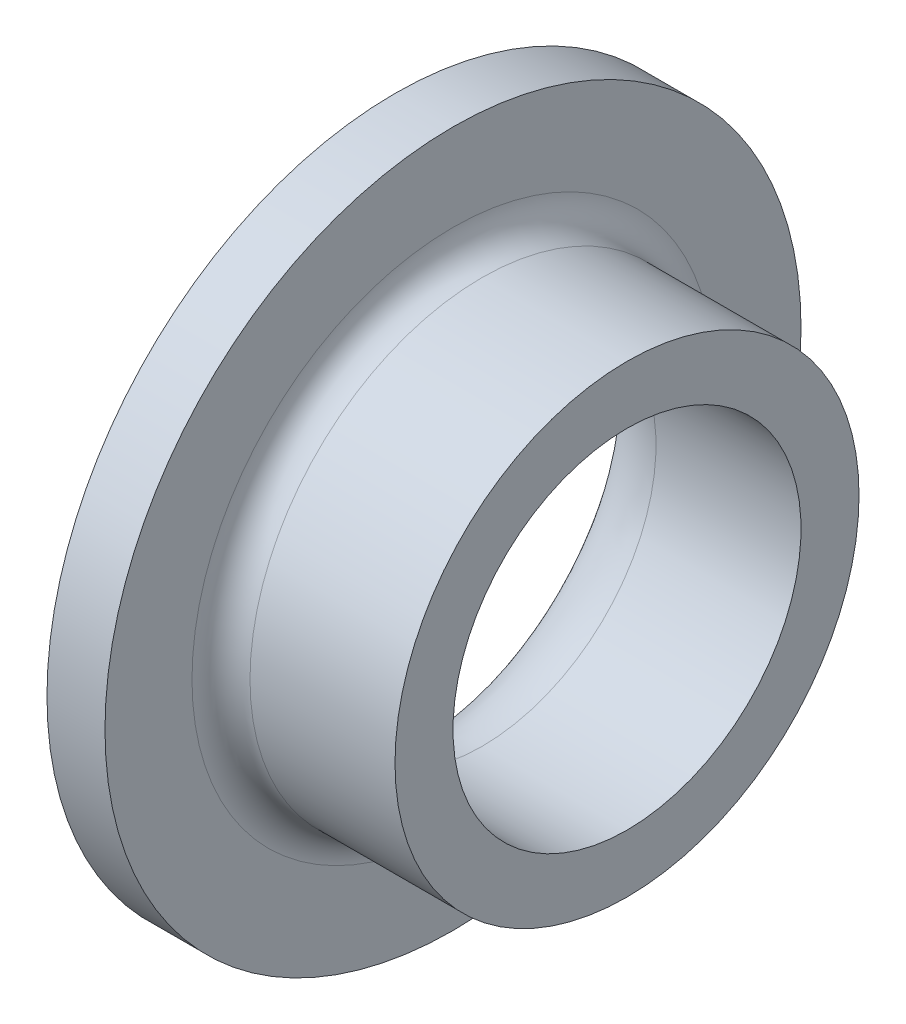
ISO-10303-21;
HEADER;
FILE_DESCRIPTION(('STEP AP214'),'2;1');
FILE_NAME('part.step','',(''),(''),'','','');
FILE_SCHEMA(('AUTOMOTIVE_DESIGN { 1 0 10303 214 1 1 1 1 }'));
ENDSEC;
DATA;
#1=APPLICATION_CONTEXT('core data for automotive mechanical design processes');
#2=APPLICATION_PROTOCOL_DEFINITION('international standard','automotive_design',2000,#1);
#3=PRODUCT_CONTEXT('',#1,'mechanical');
#4=PRODUCT('Part','Part','',(#3));
#5=PRODUCT_RELATED_PRODUCT_CATEGORY('part','',(#4));
#6=PRODUCT_DEFINITION_FORMATION('','',#4);
#7=PRODUCT_DEFINITION_CONTEXT('part definition',#1,'design');
#8=PRODUCT_DEFINITION('design','',#6,#7);
#9=PRODUCT_DEFINITION_SHAPE('','',#8);
#10=(LENGTH_UNIT() NAMED_UNIT(*) SI_UNIT(.MILLI.,.METRE.));
#11=(NAMED_UNIT(*) PLANE_ANGLE_UNIT() SI_UNIT($,.RADIAN.));
#12=(NAMED_UNIT(*) SI_UNIT($,.STERADIAN.) SOLID_ANGLE_UNIT());
#13=UNCERTAINTY_MEASURE_WITH_UNIT(LENGTH_MEASURE(1.E-05),#10,'distance_accuracy_value','');
#14=(GEOMETRIC_REPRESENTATION_CONTEXT(3) GLOBAL_UNCERTAINTY_ASSIGNED_CONTEXT((#13)) GLOBAL_UNIT_ASSIGNED_CONTEXT((#10,
#11,#12)) REPRESENTATION_CONTEXT('',''));
#15=CARTESIAN_POINT('',(0.,0.,0.));
#16=DIRECTION('',(0.,0.,1.));
#17=DIRECTION('',(1.,0.,0.));
#18=AXIS2_PLACEMENT_3D('',#15,#16,#17);
#19=CARTESIAN_POINT('',(-4.,5.25,0.));
#20=DIRECTION('',(-1.,0.,0.));
#21=DIRECTION('',(0.,0.,1.));
#22=AXIS2_PLACEMENT_3D('',#19,#20,#21);
#23=PLANE('',#22);
#24=CARTESIAN_POINT('',(-4.,0.,0.));
#25=DIRECTION('',(-1.,0.,0.));
#26=DIRECTION('',(0.,1.,0.));
#27=AXIS2_PLACEMENT_3D('',#24,#25,#26);
#28=CIRCLE('',#27,4.5);
#29=CARTESIAN_POINT('',(-4.,4.5,0.));
#30=VERTEX_POINT('',#29);
#31=EDGE_CURVE('E118',#30,#30,#28,.T.);
#32=ORIENTED_EDGE('',*,*,#31,.F.);
#33=EDGE_LOOP('',(#32));
#34=FACE_BOUND('',#33,.T.);
#35=CARTESIAN_POINT('',(-4.,0.,0.));
#36=DIRECTION('',(1.,0.,0.));
#37=DIRECTION('',(0.,1.,0.));
#38=AXIS2_PLACEMENT_3D('',#35,#36,#37);
#39=CIRCLE('',#38,6.);
#40=CARTESIAN_POINT('',(-4.,6.,0.));
#41=VERTEX_POINT('',#40);
#42=EDGE_CURVE('E19',#41,#41,#39,.T.);
#43=ORIENTED_EDGE('',*,*,#42,.F.);
#44=EDGE_LOOP('',(#43));
#45=FACE_BOUND('',#44,.T.);
#46=ADVANCED_FACE('F15',(#34,#45),#23,.T.);
#47=CARTESIAN_POINT('',(-2.5,0.,0.));
#48=DIRECTION('',(1.,0.,0.));
#49=DIRECTION('',(0.,0.,-1.));
#50=AXIS2_PLACEMENT_3D('',#47,#48,#49);
#51=TOROIDAL_SURFACE('',#50,4.5,1.5);
#52=CARTESIAN_POINT('',(-2.5,0.,0.));
#53=DIRECTION('',(1.,0.,0.));
#54=DIRECTION('',(0.,1.,0.));
#55=AXIS2_PLACEMENT_3D('',#52,#53,#54);
#56=CIRCLE('',#55,3.);
#57=CARTESIAN_POINT('',(-2.5,3.,0.));
#58=VERTEX_POINT('',#57);
#59=EDGE_CURVE('E53',#58,#58,#56,.T.);
#60=ORIENTED_EDGE('',*,*,#59,.T.);
#61=EDGE_LOOP('',(#60));
#62=FACE_BOUND('',#61,.T.);
#63=ORIENTED_EDGE('',*,*,#31,.T.);
#64=EDGE_LOOP('',(#63));
#65=FACE_BOUND('',#64,.T.);
#66=ADVANCED_FACE('F68',(#62,#65),#51,.T.);
#67=CARTESIAN_POINT('',(-3.5,0.,0.));
#68=DIRECTION('',(1.,0.,0.));
#69=DIRECTION('',(0.,1.,0.));
#70=AXIS2_PLACEMENT_3D('',#67,#68,#69);
#71=CYLINDRICAL_SURFACE('',#70,6.);
#72=ORIENTED_EDGE('',*,*,#42,.T.);
#73=EDGE_LOOP('',(#72));
#74=FACE_BOUND('',#73,.T.);
#75=CARTESIAN_POINT('',(-3.,0.,0.));
#76=DIRECTION('',(1.,0.,0.));
#77=DIRECTION('',(0.,1.,0.));
#78=AXIS2_PLACEMENT_3D('',#75,#76,#77);
#79=CIRCLE('',#78,6.);
#80=CARTESIAN_POINT('',(-3.,6.,0.));
#81=VERTEX_POINT('',#80);
#82=EDGE_CURVE('E61',#81,#81,#79,.T.);
#83=ORIENTED_EDGE('',*,*,#82,.F.);
#84=EDGE_LOOP('',(#83));
#85=FACE_BOUND('',#84,.T.);
#86=ADVANCED_FACE('F72',(#74,#85),#71,.T.);
#87=CARTESIAN_POINT('',(-1.25,0.,0.));
#88=DIRECTION('',(1.,0.,0.));
#89=DIRECTION('',(0.,1.,0.));
#90=AXIS2_PLACEMENT_3D('',#87,#88,#89);
#91=CYLINDRICAL_SURFACE('',#90,3.);
#92=CARTESIAN_POINT('',(0.,0.,0.));
#93=DIRECTION('',(1.,0.,0.));
#94=DIRECTION('',(0.,1.,0.));
#95=AXIS2_PLACEMENT_3D('',#92,#93,#94);
#96=CIRCLE('',#95,3.);
#97=CARTESIAN_POINT('',(0.,3.,0.));
#98=VERTEX_POINT('',#97);
#99=EDGE_CURVE('E86',#98,#98,#96,.F.);
#100=ORIENTED_EDGE('',*,*,#99,.F.);
#101=EDGE_LOOP('',(#100));
#102=FACE_BOUND('',#101,.T.);
#103=ORIENTED_EDGE('',*,*,#59,.F.);
#104=EDGE_LOOP('',(#103));
#105=FACE_BOUND('',#104,.T.);
#106=ADVANCED_FACE('F94',(#102,#105),#91,.F.);
#107=CARTESIAN_POINT('',(-3.,5.25,0.));
#108=DIRECTION('',(1.,0.,0.));
#109=DIRECTION('',(0.,0.,-1.));
#110=AXIS2_PLACEMENT_3D('',#107,#108,#109);
#111=PLANE('',#110);
#112=CARTESIAN_POINT('',(-3.,0.,0.));
#113=DIRECTION('',(1.,0.,0.));
#114=DIRECTION('',(0.,1.,0.));
#115=AXIS2_PLACEMENT_3D('',#112,#113,#114);
#116=CIRCLE('',#115,4.5);
#117=CARTESIAN_POINT('',(-3.,4.5,0.));
#118=VERTEX_POINT('',#117);
#119=EDGE_CURVE('E28',#118,#118,#116,.F.);
#120=ORIENTED_EDGE('',*,*,#119,.T.);
#121=EDGE_LOOP('',(#120));
#122=FACE_BOUND('',#121,.T.);
#123=ORIENTED_EDGE('',*,*,#82,.T.);
#124=EDGE_LOOP('',(#123));
#125=FACE_BOUND('',#124,.T.);
#126=ADVANCED_FACE('F91',(#122,#125),#111,.T.);
#127=CARTESIAN_POINT('',(0.,3.5,0.));
#128=DIRECTION('',(1.,0.,0.));
#129=DIRECTION('',(0.,0.,-1.));
#130=AXIS2_PLACEMENT_3D('',#127,#128,#129);
#131=PLANE('',#130);
#132=ORIENTED_EDGE('',*,*,#99,.T.);
#133=EDGE_LOOP('',(#132));
#134=FACE_BOUND('',#133,.T.);
#135=CARTESIAN_POINT('',(0.,0.,0.));
#136=DIRECTION('',(1.,0.,0.));
#137=DIRECTION('',(0.,1.,0.));
#138=AXIS2_PLACEMENT_3D('',#135,#136,#137);
#139=CIRCLE('',#138,4.);
#140=CARTESIAN_POINT('',(0.,4.,0.));
#141=VERTEX_POINT('',#140);
#142=EDGE_CURVE('E23',#141,#141,#139,.F.);
#143=ORIENTED_EDGE('',*,*,#142,.F.);
#144=EDGE_LOOP('',(#143));
#145=FACE_BOUND('',#144,.T.);
#146=ADVANCED_FACE('F44',(#134,#145),#131,.T.);
#147=CARTESIAN_POINT('',(-2.5,0.,0.));
#148=DIRECTION('',(1.,0.,0.));
#149=DIRECTION('',(0.,0.,-1.));
#150=AXIS2_PLACEMENT_3D('',#147,#148,#149);
#151=TOROIDAL_SURFACE('',#150,4.5,0.499999999999999);
#152=ORIENTED_EDGE('',*,*,#119,.F.);
#153=EDGE_LOOP('',(#152));
#154=FACE_BOUND('',#153,.T.);
#155=CARTESIAN_POINT('',(-2.5,0.,0.));
#156=DIRECTION('',(1.,0.,0.));
#157=DIRECTION('',(0.,1.,0.));
#158=AXIS2_PLACEMENT_3D('',#155,#156,#157);
#159=CIRCLE('',#158,4.);
#160=CARTESIAN_POINT('',(-2.5,4.,0.));
#161=VERTEX_POINT('',#160);
#162=EDGE_CURVE('E10',#161,#161,#159,.T.);
#163=ORIENTED_EDGE('',*,*,#162,.F.);
#164=EDGE_LOOP('',(#163));
#165=FACE_BOUND('',#164,.T.);
#166=ADVANCED_FACE('F38',(#154,#165),#151,.F.);
#167=CARTESIAN_POINT('',(-1.25,0.,0.));
#168=DIRECTION('',(1.,0.,0.));
#169=DIRECTION('',(0.,1.,0.));
#170=AXIS2_PLACEMENT_3D('',#167,#168,#169);
#171=CYLINDRICAL_SURFACE('',#170,4.);
#172=ORIENTED_EDGE('',*,*,#162,.T.);
#173=EDGE_LOOP('',(#172));
#174=FACE_BOUND('',#173,.T.);
#175=ORIENTED_EDGE('',*,*,#142,.T.);
#176=EDGE_LOOP('',(#175));
#177=FACE_BOUND('',#176,.T.);
#178=ADVANCED_FACE('F43',(#174,#177),#171,.T.);
#179=CLOSED_SHELL('',(#46,#66,#86,#106,#126,#146,#166,#178));
#180=MANIFOLD_SOLID_BREP('B1',#179);
#181=ADVANCED_BREP_SHAPE_REPRESENTATION('',(#18,#180),#14);
#182=SHAPE_DEFINITION_REPRESENTATION(#9,#181);
ENDSEC;
END-ISO-10303-21;
